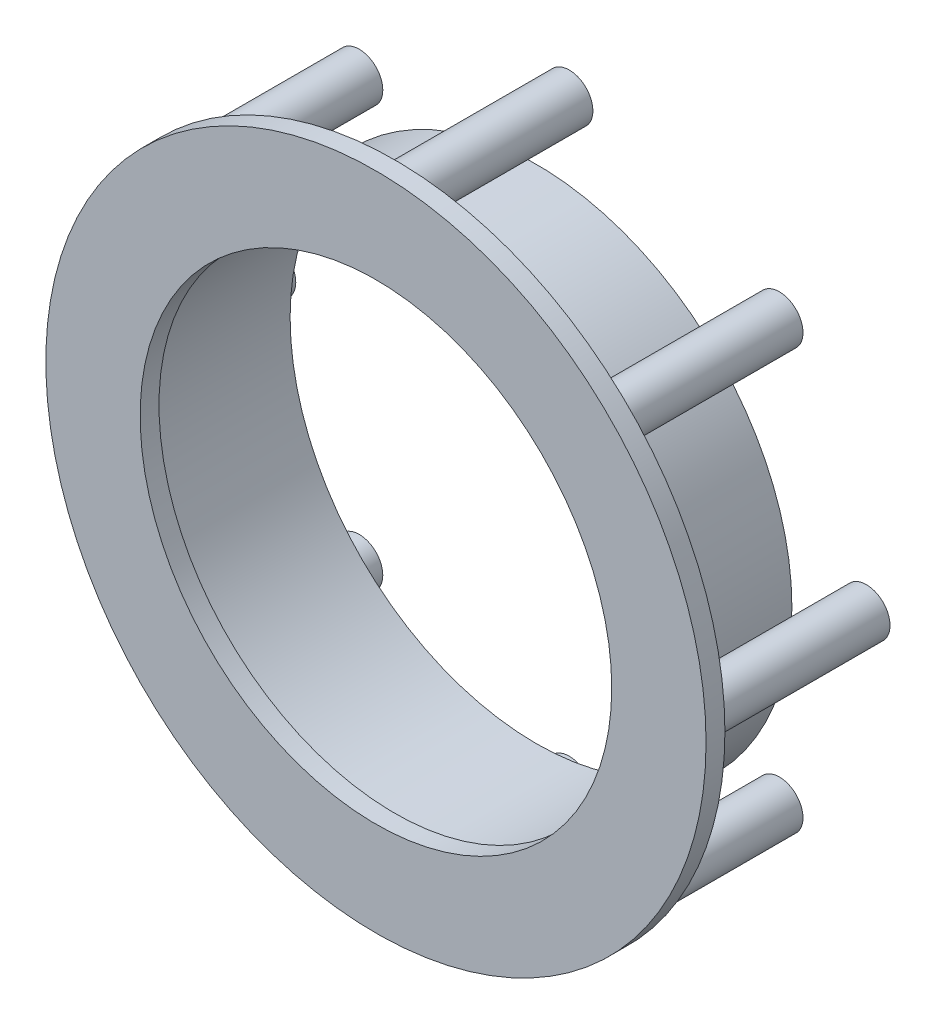
ISO-10303-21;
HEADER;
FILE_DESCRIPTION(('STEP AP214'),'2;1');
FILE_NAME('part.step','',(''),(''),'','','');
FILE_SCHEMA(('AUTOMOTIVE_DESIGN { 1 0 10303 214 1 1 1 1 }'));
ENDSEC;
DATA;
#1=APPLICATION_CONTEXT('core data for automotive mechanical design processes');
#2=APPLICATION_PROTOCOL_DEFINITION('international standard','automotive_design',2000,#1);
#3=PRODUCT_CONTEXT('',#1,'mechanical');
#4=PRODUCT('Part','Part','',(#3));
#5=PRODUCT_RELATED_PRODUCT_CATEGORY('part','',(#4));
#6=PRODUCT_DEFINITION_FORMATION('','',#4);
#7=PRODUCT_DEFINITION_CONTEXT('part definition',#1,'design');
#8=PRODUCT_DEFINITION('design','',#6,#7);
#9=PRODUCT_DEFINITION_SHAPE('','',#8);
#10=(LENGTH_UNIT() NAMED_UNIT(*) SI_UNIT(.MILLI.,.METRE.));
#11=(NAMED_UNIT(*) PLANE_ANGLE_UNIT() SI_UNIT($,.RADIAN.));
#12=(NAMED_UNIT(*) SI_UNIT($,.STERADIAN.) SOLID_ANGLE_UNIT());
#13=UNCERTAINTY_MEASURE_WITH_UNIT(LENGTH_MEASURE(1.E-05),#10,'distance_accuracy_value','');
#14=(GEOMETRIC_REPRESENTATION_CONTEXT(3) GLOBAL_UNCERTAINTY_ASSIGNED_CONTEXT((#13)) GLOBAL_UNIT_ASSIGNED_CONTEXT((#10,
#11,#12)) REPRESENTATION_CONTEXT('',''));
#15=CARTESIAN_POINT('',(0.,0.,0.));
#16=DIRECTION('',(0.,0.,1.));
#17=DIRECTION('',(1.,0.,0.));
#18=AXIS2_PLACEMENT_3D('',#15,#16,#17);
#19=CARTESIAN_POINT('',(0.,0.,0.));
#20=DIRECTION('',(0.,0.,1.));
#21=DIRECTION('',(1.,0.,0.));
#22=AXIS2_PLACEMENT_3D('',#19,#20,#21);
#23=PLANE('',#22);
#24=CARTESIAN_POINT('',(0.,0.,0.));
#25=DIRECTION('',(0.,0.,1.));
#26=DIRECTION('',(1.,0.,0.));
#27=AXIS2_PLACEMENT_3D('',#24,#25,#26);
#28=CIRCLE('',#27,25.);
#29=CARTESIAN_POINT('',(25.,0.,0.));
#30=VERTEX_POINT('',#29);
#31=EDGE_CURVE('E90',#30,#30,#28,.T.);
#32=ORIENTED_EDGE('',*,*,#31,.T.);
#33=EDGE_LOOP('',(#32));
#34=FACE_BOUND('',#33,.T.);
#35=CARTESIAN_POINT('',(0.,0.,0.));
#36=DIRECTION('',(0.,0.,-1.));
#37=DIRECTION('',(-1.,0.,0.));
#38=AXIS2_PLACEMENT_3D('',#35,#36,#37);
#39=CIRCLE('',#38,26.1);
#40=CARTESIAN_POINT('',(-26.1,0.,0.));
#41=VERTEX_POINT('',#40);
#42=EDGE_CURVE('E102',#41,#41,#39,.T.);
#43=ORIENTED_EDGE('',*,*,#42,.T.);
#44=EDGE_LOOP('',(#43));
#45=FACE_BOUND('',#44,.T.);
#46=ADVANCED_FACE('F37',(#34,#45),#23,.F.);
#47=CARTESIAN_POINT('',(0.,0.,2.));
#48=DIRECTION('',(0.,0.,1.));
#49=DIRECTION('',(1.,0.,0.));
#50=AXIS2_PLACEMENT_3D('',#47,#48,#49);
#51=PLANE('',#50);
#52=CARTESIAN_POINT('',(0.,0.,2.));
#53=DIRECTION('',(0.,0.,1.));
#54=DIRECTION('',(1.,0.,0.));
#55=AXIS2_PLACEMENT_3D('',#52,#53,#54);
#56=CIRCLE('',#55,35.);
#57=CARTESIAN_POINT('',(35.,0.,2.));
#58=VERTEX_POINT('',#57);
#59=EDGE_CURVE('E81',#58,#58,#56,.T.);
#60=ORIENTED_EDGE('',*,*,#59,.T.);
#61=EDGE_LOOP('',(#60));
#62=FACE_BOUND('',#61,.T.);
#63=CARTESIAN_POINT('',(0.,0.,2.));
#64=DIRECTION('',(0.,0.,1.));
#65=DIRECTION('',(1.,0.,0.));
#66=AXIS2_PLACEMENT_3D('',#63,#64,#65);
#67=CIRCLE('',#66,25.);
#68=CARTESIAN_POINT('',(25.,0.,2.));
#69=VERTEX_POINT('',#68);
#70=EDGE_CURVE('E86',#69,#69,#67,.T.);
#71=ORIENTED_EDGE('',*,*,#70,.F.);
#72=EDGE_LOOP('',(#71));
#73=FACE_BOUND('',#72,.T.);
#74=ADVANCED_FACE('F157',(#62,#73),#51,.T.);
#75=CARTESIAN_POINT('',(-22.2738636073765,22.273863607376,0.));
#76=DIRECTION('',(0.,0.,1.));
#77=DIRECTION('',(1.,0.,0.));
#78=AXIS2_PLACEMENT_3D('',#75,#76,#77);
#79=CIRCLE('',#78,2.5);
#80=CARTESIAN_POINT('',(-19.7738636073765,22.273863607376,0.));
#81=VERTEX_POINT('',#80);
#82=EDGE_CURVE('E10',#81,#81,#79,.F.);
#83=ORIENTED_EDGE('',*,*,#82,.F.);
#84=EDGE_LOOP('',(#83));
#85=FACE_BOUND('',#84,.T.);
#86=CARTESIAN_POINT('',(-3.29944986520676E-13,31.5,0.));
#87=DIRECTION('',(0.,0.,1.));
#88=DIRECTION('',(1.,0.,0.));
#89=AXIS2_PLACEMENT_3D('',#86,#87,#88);
#90=CIRCLE('',#89,2.5);
#91=CARTESIAN_POINT('',(2.49999999999967,31.5,0.));
#92=VERTEX_POINT('',#91);
#93=EDGE_CURVE('E45',#92,#92,#90,.F.);
#94=ORIENTED_EDGE('',*,*,#93,.F.);
#95=EDGE_LOOP('',(#94));
#96=FACE_BOUND('',#95,.T.);
#97=CARTESIAN_POINT('',(22.2738636073761,22.2738636073764,0.));
#98=DIRECTION('',(0.,0.,1.));
#99=DIRECTION('',(1.,0.,0.));
#100=AXIS2_PLACEMENT_3D('',#97,#98,#99);
#101=CIRCLE('',#100,2.5);
#102=CARTESIAN_POINT('',(24.7738636073761,22.2738636073764,0.));
#103=VERTEX_POINT('',#102);
#104=EDGE_CURVE('E50',#103,#103,#101,.F.);
#105=ORIENTED_EDGE('',*,*,#104,.F.);
#106=EDGE_LOOP('',(#105));
#107=FACE_BOUND('',#106,.T.);
#108=CARTESIAN_POINT('',(31.5,2.19963324347117E-13,0.));
#109=DIRECTION('',(0.,0.,1.));
#110=DIRECTION('',(1.,0.,0.));
#111=AXIS2_PLACEMENT_3D('',#108,#109,#110);
#112=CIRCLE('',#111,2.5);
#113=CARTESIAN_POINT('',(34.,2.19963324347117E-13,0.));
#114=VERTEX_POINT('',#113);
#115=EDGE_CURVE('E55',#114,#114,#112,.F.);
#116=ORIENTED_EDGE('',*,*,#115,.F.);
#117=EDGE_LOOP('',(#116));
#118=FACE_BOUND('',#117,.T.);
#119=CARTESIAN_POINT('',(22.2738636073764,-22.2738636073761,0.));
#120=DIRECTION('',(0.,0.,1.));
#121=DIRECTION('',(1.,0.,0.));
#122=AXIS2_PLACEMENT_3D('',#119,#120,#121);
#123=CIRCLE('',#122,2.5);
#124=CARTESIAN_POINT('',(24.7738636073764,-22.2738636073761,0.));
#125=VERTEX_POINT('',#124);
#126=EDGE_CURVE('E61',#125,#125,#123,.F.);
#127=ORIENTED_EDGE('',*,*,#126,.F.);
#128=EDGE_LOOP('',(#127));
#129=FACE_BOUND('',#128,.T.);
#130=CARTESIAN_POINT('',(1.09981662173559E-13,-31.5,0.));
#131=DIRECTION('',(0.,0.,1.));
#132=DIRECTION('',(1.,0.,0.));
#133=AXIS2_PLACEMENT_3D('',#130,#131,#132);
#134=CIRCLE('',#133,2.5);
#135=CARTESIAN_POINT('',(2.50000000000011,-31.5,0.));
#136=VERTEX_POINT('',#135);
#137=EDGE_CURVE('E65',#136,#136,#134,.F.);
#138=ORIENTED_EDGE('',*,*,#137,.F.);
#139=EDGE_LOOP('',(#138));
#140=FACE_BOUND('',#139,.T.);
#141=CARTESIAN_POINT('',(-22.2738636073762,-22.2738636073763,0.));
#142=DIRECTION('',(0.,0.,1.));
#143=DIRECTION('',(1.,0.,0.));
#144=AXIS2_PLACEMENT_3D('',#141,#142,#143);
#145=CIRCLE('',#144,2.5);
#146=CARTESIAN_POINT('',(-19.7738636073762,-22.2738636073763,0.));
#147=VERTEX_POINT('',#146);
#148=EDGE_CURVE('E69',#147,#147,#145,.F.);
#149=ORIENTED_EDGE('',*,*,#148,.F.);
#150=EDGE_LOOP('',(#149));
#151=FACE_BOUND('',#150,.T.);
#152=CARTESIAN_POINT('',(-31.5,0.,0.));
#153=DIRECTION('',(0.,0.,1.));
#154=DIRECTION('',(1.,0.,0.));
#155=AXIS2_PLACEMENT_3D('',#152,#153,#154);
#156=CIRCLE('',#155,2.5);
#157=CARTESIAN_POINT('',(-29.,0.,0.));
#158=VERTEX_POINT('',#157);
#159=EDGE_CURVE('E73',#158,#158,#156,.F.);
#160=ORIENTED_EDGE('',*,*,#159,.F.);
#161=EDGE_LOOP('',(#160));
#162=FACE_BOUND('',#161,.T.);
#163=CARTESIAN_POINT('',(0.,0.,0.));
#164=DIRECTION('',(0.,0.,1.));
#165=DIRECTION('',(1.,0.,0.));
#166=AXIS2_PLACEMENT_3D('',#163,#164,#165);
#167=CIRCLE('',#166,27.1);
#168=CARTESIAN_POINT('',(27.1,0.,0.));
#169=VERTEX_POINT('',#168);
#170=EDGE_CURVE('E77',#169,#169,#167,.F.);
#171=ORIENTED_EDGE('',*,*,#170,.F.);
#172=EDGE_LOOP('',(#171));
#173=FACE_BOUND('',#172,.T.);
#174=CARTESIAN_POINT('',(0.,0.,0.));
#175=DIRECTION('',(0.,0.,1.));
#176=DIRECTION('',(1.,0.,0.));
#177=AXIS2_PLACEMENT_3D('',#174,#175,#176);
#178=CIRCLE('',#177,35.);
#179=CARTESIAN_POINT('',(35.,0.,0.));
#180=VERTEX_POINT('',#179);
#181=EDGE_CURVE('E82',#180,#180,#178,.T.);
#182=ORIENTED_EDGE('',*,*,#181,.F.);
#183=EDGE_LOOP('',(#182));
#184=FACE_BOUND('',#183,.T.);
#185=ADVANCED_FACE('F159',(#85,#96,#107,#118,#129,#140,#151,#162,#173,#184),#23,.F.);
#186=CARTESIAN_POINT('',(0.,0.,2.));
#187=DIRECTION('',(0.,0.,-1.));
#188=DIRECTION('',(-1.,0.,0.));
#189=AXIS2_PLACEMENT_3D('',#186,#187,#188);
#190=CYLINDRICAL_SURFACE('',#189,35.);
#191=ORIENTED_EDGE('',*,*,#59,.F.);
#192=EDGE_LOOP('',(#191));
#193=FACE_BOUND('',#192,.T.);
#194=ORIENTED_EDGE('',*,*,#181,.T.);
#195=EDGE_LOOP('',(#194));
#196=FACE_BOUND('',#195,.T.);
#197=ADVANCED_FACE('F39',(#193,#196),#190,.T.);
#198=CARTESIAN_POINT('',(0.,0.,2.));
#199=DIRECTION('',(0.,0.,-1.));
#200=DIRECTION('',(-1.,0.,0.));
#201=AXIS2_PLACEMENT_3D('',#198,#199,#200);
#202=CYLINDRICAL_SURFACE('',#201,25.);
#203=ORIENTED_EDGE('',*,*,#70,.T.);
#204=EDGE_LOOP('',(#203));
#205=FACE_BOUND('',#204,.T.);
#206=ORIENTED_EDGE('',*,*,#31,.F.);
#207=EDGE_LOOP('',(#206));
#208=FACE_BOUND('',#207,.T.);
#209=ADVANCED_FACE('F171',(#205,#208),#202,.F.);
#210=CARTESIAN_POINT('',(0.,0.,-15.));
#211=DIRECTION('',(0.,0.,-1.));
#212=DIRECTION('',(-1.,0.,0.));
#213=AXIS2_PLACEMENT_3D('',#210,#211,#212);
#214=PLANE('',#213);
#215=CARTESIAN_POINT('',(0.,0.,-15.));
#216=DIRECTION('',(0.,0.,-1.));
#217=DIRECTION('',(-1.,0.,0.));
#218=AXIS2_PLACEMENT_3D('',#215,#216,#217);
#219=CIRCLE('',#218,27.1);
#220=CARTESIAN_POINT('',(-27.1,0.,-15.));
#221=VERTEX_POINT('',#220);
#222=EDGE_CURVE('E94',#221,#221,#219,.T.);
#223=ORIENTED_EDGE('',*,*,#222,.T.);
#224=EDGE_LOOP('',(#223));
#225=FACE_BOUND('',#224,.T.);
#226=CARTESIAN_POINT('',(0.,0.,-15.));
#227=DIRECTION('',(0.,0.,-1.));
#228=DIRECTION('',(-1.,0.,0.));
#229=AXIS2_PLACEMENT_3D('',#226,#227,#228);
#230=CIRCLE('',#229,26.1);
#231=CARTESIAN_POINT('',(-26.1,0.,-15.));
#232=VERTEX_POINT('',#231);
#233=EDGE_CURVE('E101',#232,#232,#230,.T.);
#234=ORIENTED_EDGE('',*,*,#233,.F.);
#235=EDGE_LOOP('',(#234));
#236=FACE_BOUND('',#235,.T.);
#237=ADVANCED_FACE('F195',(#225,#236),#214,.T.);
#238=CARTESIAN_POINT('',(0.,0.,-15.));
#239=DIRECTION('',(0.,0.,1.));
#240=DIRECTION('',(1.,0.,0.));
#241=AXIS2_PLACEMENT_3D('',#238,#239,#240);
#242=CYLINDRICAL_SURFACE('',#241,27.1);
#243=ORIENTED_EDGE('',*,*,#222,.F.);
#244=EDGE_LOOP('',(#243));
#245=FACE_BOUND('',#244,.T.);
#246=ORIENTED_EDGE('',*,*,#170,.T.);
#247=EDGE_LOOP('',(#246));
#248=FACE_BOUND('',#247,.T.);
#249=ADVANCED_FACE('F192',(#245,#248),#242,.T.);
#250=CARTESIAN_POINT('',(0.,0.,-15.));
#251=DIRECTION('',(0.,0.,1.));
#252=DIRECTION('',(1.,0.,0.));
#253=AXIS2_PLACEMENT_3D('',#250,#251,#252);
#254=CYLINDRICAL_SURFACE('',#253,26.1);
#255=ORIENTED_EDGE('',*,*,#233,.T.);
#256=EDGE_LOOP('',(#255));
#257=FACE_BOUND('',#256,.T.);
#258=ORIENTED_EDGE('',*,*,#42,.F.);
#259=EDGE_LOOP('',(#258));
#260=FACE_BOUND('',#259,.T.);
#261=ADVANCED_FACE('F194',(#257,#260),#254,.F.);
#262=CARTESIAN_POINT('',(-31.5,0.,-18.5));
#263=DIRECTION('',(0.,0.,1.));
#264=DIRECTION('',(1.,0.,0.));
#265=AXIS2_PLACEMENT_3D('',#262,#263,#264);
#266=CYLINDRICAL_SURFACE('',#265,2.5);
#267=CARTESIAN_POINT('',(-31.5,0.,-18.5));
#268=DIRECTION('',(0.,0.,-1.));
#269=DIRECTION('',(-1.,0.,0.));
#270=AXIS2_PLACEMENT_3D('',#267,#268,#269);
#271=CIRCLE('',#270,2.5);
#272=CARTESIAN_POINT('',(-34.,0.,-18.5));
#273=VERTEX_POINT('',#272);
#274=EDGE_CURVE('E106',#273,#273,#271,.T.);
#275=ORIENTED_EDGE('',*,*,#274,.F.);
#276=EDGE_LOOP('',(#275));
#277=FACE_BOUND('',#276,.T.);
#278=ORIENTED_EDGE('',*,*,#159,.T.);
#279=EDGE_LOOP('',(#278));
#280=FACE_BOUND('',#279,.T.);
#281=ADVANCED_FACE('F202',(#277,#280),#266,.T.);
#282=CARTESIAN_POINT('',(-31.5,0.,-18.5));
#283=DIRECTION('',(0.,0.,-1.));
#284=DIRECTION('',(-1.,0.,0.));
#285=AXIS2_PLACEMENT_3D('',#282,#283,#284);
#286=PLANE('',#285);
#287=ORIENTED_EDGE('',*,*,#274,.T.);
#288=EDGE_LOOP('',(#287));
#289=FACE_BOUND('',#288,.T.);
#290=ADVANCED_FACE('F250',(#289),#286,.T.);
#291=CARTESIAN_POINT('',(-22.2738636073762,-22.2738636073763,-18.5));
#292=DIRECTION('',(0.,0.,1.));
#293=DIRECTION('',(1.,0.,0.));
#294=AXIS2_PLACEMENT_3D('',#291,#292,#293);
#295=CYLINDRICAL_SURFACE('',#294,2.5);
#296=CARTESIAN_POINT('',(-22.2738636073762,-22.2738636073763,-18.5));
#297=DIRECTION('',(0.,0.,-1.));
#298=DIRECTION('',(-1.,0.,0.));
#299=AXIS2_PLACEMENT_3D('',#296,#297,#298);
#300=CIRCLE('',#299,2.5);
#301=CARTESIAN_POINT('',(-24.7738636073762,-22.2738636073763,-18.5));
#302=VERTEX_POINT('',#301);
#303=EDGE_CURVE('E113',#302,#302,#300,.T.);
#304=ORIENTED_EDGE('',*,*,#303,.F.);
#305=EDGE_LOOP('',(#304));
#306=FACE_BOUND('',#305,.T.);
#307=ORIENTED_EDGE('',*,*,#148,.T.);
#308=EDGE_LOOP('',(#307));
#309=FACE_BOUND('',#308,.T.);
#310=ADVANCED_FACE('F260',(#306,#309),#295,.T.);
#311=CARTESIAN_POINT('',(-22.2738636073762,-22.2738636073763,-18.5));
#312=DIRECTION('',(0.,0.,-1.));
#313=DIRECTION('',(-1.,0.,0.));
#314=AXIS2_PLACEMENT_3D('',#311,#312,#313);
#315=PLANE('',#314);
#316=ORIENTED_EDGE('',*,*,#303,.T.);
#317=EDGE_LOOP('',(#316));
#318=FACE_BOUND('',#317,.T.);
#319=ADVANCED_FACE('F270',(#318),#315,.T.);
#320=CARTESIAN_POINT('',(1.09981662173559E-13,-31.5,-18.5));
#321=DIRECTION('',(0.,0.,1.));
#322=DIRECTION('',(1.,0.,0.));
#323=AXIS2_PLACEMENT_3D('',#320,#321,#322);
#324=CYLINDRICAL_SURFACE('',#323,2.5);
#325=CARTESIAN_POINT('',(1.09981662173559E-13,-31.5,-18.5));
#326=DIRECTION('',(0.,0.,-1.));
#327=DIRECTION('',(-1.,0.,0.));
#328=AXIS2_PLACEMENT_3D('',#325,#326,#327);
#329=CIRCLE('',#328,2.5);
#330=CARTESIAN_POINT('',(-2.49999999999989,-31.5,-18.5));
#331=VERTEX_POINT('',#330);
#332=EDGE_CURVE('E117',#331,#331,#329,.T.);
#333=ORIENTED_EDGE('',*,*,#332,.F.);
#334=EDGE_LOOP('',(#333));
#335=FACE_BOUND('',#334,.T.);
#336=ORIENTED_EDGE('',*,*,#137,.T.);
#337=EDGE_LOOP('',(#336));
#338=FACE_BOUND('',#337,.T.);
#339=ADVANCED_FACE('F280',(#335,#338),#324,.T.);
#340=CARTESIAN_POINT('',(1.09981662173559E-13,-31.5,-18.5));
#341=DIRECTION('',(0.,0.,-1.));
#342=DIRECTION('',(-1.,0.,0.));
#343=AXIS2_PLACEMENT_3D('',#340,#341,#342);
#344=PLANE('',#343);
#345=ORIENTED_EDGE('',*,*,#332,.T.);
#346=EDGE_LOOP('',(#345));
#347=FACE_BOUND('',#346,.T.);
#348=ADVANCED_FACE('F290',(#347),#344,.T.);
#349=CARTESIAN_POINT('',(22.2738636073764,-22.2738636073761,-18.5));
#350=DIRECTION('',(0.,0.,1.));
#351=DIRECTION('',(1.,0.,0.));
#352=AXIS2_PLACEMENT_3D('',#349,#350,#351);
#353=CYLINDRICAL_SURFACE('',#352,2.5);
#354=CARTESIAN_POINT('',(22.2738636073764,-22.2738636073761,-18.5));
#355=DIRECTION('',(0.,0.,-1.));
#356=DIRECTION('',(-1.,0.,0.));
#357=AXIS2_PLACEMENT_3D('',#354,#355,#356);
#358=CIRCLE('',#357,2.5);
#359=CARTESIAN_POINT('',(19.7738636073764,-22.2738636073761,-18.5));
#360=VERTEX_POINT('',#359);
#361=EDGE_CURVE('E121',#360,#360,#358,.T.);
#362=ORIENTED_EDGE('',*,*,#361,.F.);
#363=EDGE_LOOP('',(#362));
#364=FACE_BOUND('',#363,.T.);
#365=ORIENTED_EDGE('',*,*,#126,.T.);
#366=EDGE_LOOP('',(#365));
#367=FACE_BOUND('',#366,.T.);
#368=ADVANCED_FACE('F300',(#364,#367),#353,.T.);
#369=CARTESIAN_POINT('',(22.2738636073764,-22.2738636073761,-18.5));
#370=DIRECTION('',(0.,0.,-1.));
#371=DIRECTION('',(-1.,0.,0.));
#372=AXIS2_PLACEMENT_3D('',#369,#370,#371);
#373=PLANE('',#372);
#374=ORIENTED_EDGE('',*,*,#361,.T.);
#375=EDGE_LOOP('',(#374));
#376=FACE_BOUND('',#375,.T.);
#377=ADVANCED_FACE('F310',(#376),#373,.T.);
#378=CARTESIAN_POINT('',(31.5,2.19963324347117E-13,-18.5));
#379=DIRECTION('',(0.,0.,1.));
#380=DIRECTION('',(1.,0.,0.));
#381=AXIS2_PLACEMENT_3D('',#378,#379,#380);
#382=CYLINDRICAL_SURFACE('',#381,2.5);
#383=CARTESIAN_POINT('',(31.5,2.19963324347117E-13,-18.5));
#384=DIRECTION('',(0.,0.,-1.));
#385=DIRECTION('',(-1.,0.,0.));
#386=AXIS2_PLACEMENT_3D('',#383,#384,#385);
#387=CIRCLE('',#386,2.5);
#388=CARTESIAN_POINT('',(29.,2.19963324347117E-13,-18.5));
#389=VERTEX_POINT('',#388);
#390=EDGE_CURVE('E125',#389,#389,#387,.T.);
#391=ORIENTED_EDGE('',*,*,#390,.F.);
#392=EDGE_LOOP('',(#391));
#393=FACE_BOUND('',#392,.T.);
#394=ORIENTED_EDGE('',*,*,#115,.T.);
#395=EDGE_LOOP('',(#394));
#396=FACE_BOUND('',#395,.T.);
#397=ADVANCED_FACE('F320',(#393,#396),#382,.T.);
#398=CARTESIAN_POINT('',(31.5,2.19963324347117E-13,-18.5));
#399=DIRECTION('',(0.,0.,-1.));
#400=DIRECTION('',(-1.,0.,0.));
#401=AXIS2_PLACEMENT_3D('',#398,#399,#400);
#402=PLANE('',#401);
#403=ORIENTED_EDGE('',*,*,#390,.T.);
#404=EDGE_LOOP('',(#403));
#405=FACE_BOUND('',#404,.T.);
#406=ADVANCED_FACE('F330',(#405),#402,.T.);
#407=CARTESIAN_POINT('',(22.2738636073761,22.2738636073764,-18.5));
#408=DIRECTION('',(0.,0.,1.));
#409=DIRECTION('',(1.,0.,0.));
#410=AXIS2_PLACEMENT_3D('',#407,#408,#409);
#411=CYLINDRICAL_SURFACE('',#410,2.5);
#412=CARTESIAN_POINT('',(22.2738636073761,22.2738636073764,-18.5));
#413=DIRECTION('',(0.,0.,-1.));
#414=DIRECTION('',(-1.,0.,0.));
#415=AXIS2_PLACEMENT_3D('',#412,#413,#414);
#416=CIRCLE('',#415,2.5);
#417=CARTESIAN_POINT('',(19.7738636073761,22.2738636073764,-18.5));
#418=VERTEX_POINT('',#417);
#419=EDGE_CURVE('E129',#418,#418,#416,.T.);
#420=ORIENTED_EDGE('',*,*,#419,.F.);
#421=EDGE_LOOP('',(#420));
#422=FACE_BOUND('',#421,.T.);
#423=ORIENTED_EDGE('',*,*,#104,.T.);
#424=EDGE_LOOP('',(#423));
#425=FACE_BOUND('',#424,.T.);
#426=ADVANCED_FACE('F340',(#422,#425),#411,.T.);
#427=CARTESIAN_POINT('',(22.2738636073761,22.2738636073764,-18.5));
#428=DIRECTION('',(0.,0.,-1.));
#429=DIRECTION('',(-1.,0.,0.));
#430=AXIS2_PLACEMENT_3D('',#427,#428,#429);
#431=PLANE('',#430);
#432=ORIENTED_EDGE('',*,*,#419,.T.);
#433=EDGE_LOOP('',(#432));
#434=FACE_BOUND('',#433,.T.);
#435=ADVANCED_FACE('F350',(#434),#431,.T.);
#436=CARTESIAN_POINT('',(-3.29944986520676E-13,31.5,-18.5));
#437=DIRECTION('',(0.,0.,1.));
#438=DIRECTION('',(1.,0.,0.));
#439=AXIS2_PLACEMENT_3D('',#436,#437,#438);
#440=CYLINDRICAL_SURFACE('',#439,2.5);
#441=CARTESIAN_POINT('',(-3.29944986520676E-13,31.5,-18.5));
#442=DIRECTION('',(0.,0.,-1.));
#443=DIRECTION('',(-1.,0.,0.));
#444=AXIS2_PLACEMENT_3D('',#441,#442,#443);
#445=CIRCLE('',#444,2.5);
#446=CARTESIAN_POINT('',(-2.50000000000033,31.5,-18.5));
#447=VERTEX_POINT('',#446);
#448=EDGE_CURVE('E133',#447,#447,#445,.T.);
#449=ORIENTED_EDGE('',*,*,#448,.F.);
#450=EDGE_LOOP('',(#449));
#451=FACE_BOUND('',#450,.T.);
#452=ORIENTED_EDGE('',*,*,#93,.T.);
#453=EDGE_LOOP('',(#452));
#454=FACE_BOUND('',#453,.T.);
#455=ADVANCED_FACE('F153',(#451,#454),#440,.T.);
#456=CARTESIAN_POINT('',(-3.29944986520676E-13,31.5,-18.5));
#457=DIRECTION('',(0.,0.,-1.));
#458=DIRECTION('',(-1.,0.,0.));
#459=AXIS2_PLACEMENT_3D('',#456,#457,#458);
#460=PLANE('',#459);
#461=ORIENTED_EDGE('',*,*,#448,.T.);
#462=EDGE_LOOP('',(#461));
#463=FACE_BOUND('',#462,.T.);
#464=ADVANCED_FACE('F146',(#463),#460,.T.);
#465=CARTESIAN_POINT('',(-22.2738636073765,22.273863607376,-18.5));
#466=DIRECTION('',(0.,0.,1.));
#467=DIRECTION('',(1.,0.,0.));
#468=AXIS2_PLACEMENT_3D('',#465,#466,#467);
#469=CYLINDRICAL_SURFACE('',#468,2.5);
#470=CARTESIAN_POINT('',(-22.2738636073765,22.273863607376,-18.5));
#471=DIRECTION('',(0.,0.,-1.));
#472=DIRECTION('',(-1.,0.,0.));
#473=AXIS2_PLACEMENT_3D('',#470,#471,#472);
#474=CIRCLE('',#473,2.5);
#475=CARTESIAN_POINT('',(-24.7738636073765,22.273863607376,-18.5));
#476=VERTEX_POINT('',#475);
#477=EDGE_CURVE('E137',#476,#476,#474,.T.);
#478=ORIENTED_EDGE('',*,*,#477,.F.);
#479=EDGE_LOOP('',(#478));
#480=FACE_BOUND('',#479,.T.);
#481=ORIENTED_EDGE('',*,*,#82,.T.);
#482=EDGE_LOOP('',(#481));
#483=FACE_BOUND('',#482,.T.);
#484=ADVANCED_FACE('F144',(#480,#483),#469,.T.);
#485=CARTESIAN_POINT('',(-22.2738636073765,22.273863607376,-18.5));
#486=DIRECTION('',(0.,0.,-1.));
#487=DIRECTION('',(-1.,0.,0.));
#488=AXIS2_PLACEMENT_3D('',#485,#486,#487);
#489=PLANE('',#488);
#490=ORIENTED_EDGE('',*,*,#477,.T.);
#491=EDGE_LOOP('',(#490));
#492=FACE_BOUND('',#491,.T.);
#493=ADVANCED_FACE('F142',(#492),#489,.T.);
#494=CLOSED_SHELL('',(#46,#74,#185,#197,#209,#237,#249,#261,#281,#290,#310,#319,#339,#348,#368,
#377,#397,#406,#426,#435,#455,#464,#484,#493));
#495=MANIFOLD_SOLID_BREP('B2',#494);
#496=ADVANCED_BREP_SHAPE_REPRESENTATION('',(#18,#495),#14);
#497=SHAPE_DEFINITION_REPRESENTATION(#9,#496);
ENDSEC;
END-ISO-10303-21;
